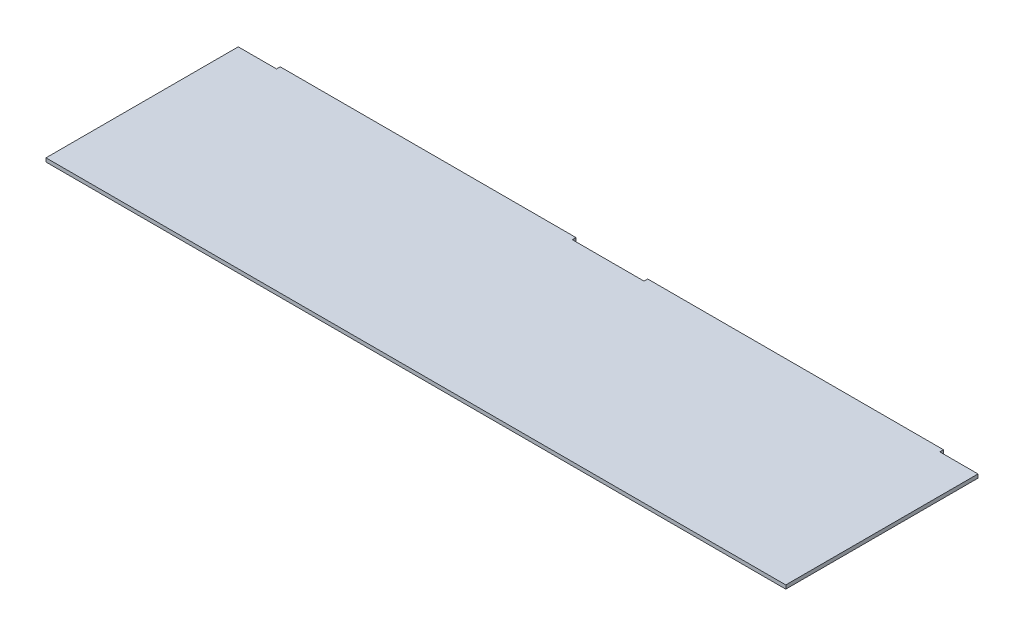
ISO-10303-21;
HEADER;
FILE_DESCRIPTION(('STEP AP214'),'2;1');
FILE_NAME('part.step','',(''),(''),'','','');
FILE_SCHEMA(('AUTOMOTIVE_DESIGN { 1 0 10303 214 1 1 1 1 }'));
ENDSEC;
DATA;
#1=APPLICATION_CONTEXT('core data for automotive mechanical design processes');
#2=APPLICATION_PROTOCOL_DEFINITION('international standard','automotive_design',2000,#1);
#3=PRODUCT_CONTEXT('',#1,'mechanical');
#4=PRODUCT('Part','Part','',(#3));
#5=PRODUCT_RELATED_PRODUCT_CATEGORY('part','',(#4));
#6=PRODUCT_DEFINITION_FORMATION('','',#4);
#7=PRODUCT_DEFINITION_CONTEXT('part definition',#1,'design');
#8=PRODUCT_DEFINITION('design','',#6,#7);
#9=PRODUCT_DEFINITION_SHAPE('','',#8);
#10=(LENGTH_UNIT() NAMED_UNIT(*) SI_UNIT(.MILLI.,.METRE.));
#11=(NAMED_UNIT(*) PLANE_ANGLE_UNIT() SI_UNIT($,.RADIAN.));
#12=(NAMED_UNIT(*) SI_UNIT($,.STERADIAN.) SOLID_ANGLE_UNIT());
#13=UNCERTAINTY_MEASURE_WITH_UNIT(LENGTH_MEASURE(1.E-05),#10,'distance_accuracy_value','');
#14=(GEOMETRIC_REPRESENTATION_CONTEXT(3) GLOBAL_UNCERTAINTY_ASSIGNED_CONTEXT((#13)) GLOBAL_UNIT_ASSIGNED_CONTEXT((#10,
#11,#12)) REPRESENTATION_CONTEXT('',''));
#15=CARTESIAN_POINT('',(0.,0.,0.));
#16=DIRECTION('',(0.,0.,1.));
#17=DIRECTION('',(1.,0.,0.));
#18=AXIS2_PLACEMENT_3D('',#15,#16,#17);
#19=CARTESIAN_POINT('',(-317.6778,1.5875,-82.55));
#20=DIRECTION('',(0.,0.,1.));
#21=DIRECTION('',(1.,0.,0.));
#22=AXIS2_PLACEMENT_3D('',#19,#20,#21);
#23=PLANE('',#22);
#24=DIRECTION('',(0.,-1.,0.));
#25=VECTOR('',#24,1.);
#26=CARTESIAN_POINT('',(284.822900000001,-1.58750000000007,-82.55));
#27=LINE('',#26,#25);
#28=CARTESIAN_POINT('',(284.822900000001,1.5875,-82.55));
#29=VERTEX_POINT('',#28);
#30=CARTESIAN_POINT('',(284.822900000001,-1.5875,-82.55));
#31=VERTEX_POINT('',#30);
#32=EDGE_CURVE('E56',#29,#31,#27,.T.);
#33=ORIENTED_EDGE('',*,*,#32,.F.);
#34=DIRECTION('',(-1.,0.,0.));
#35=VECTOR('',#34,1.);
#36=CARTESIAN_POINT('',(-317.6778,1.5875,-82.55));
#37=LINE('',#36,#35);
#38=CARTESIAN_POINT('',(317.6778,1.5875,-82.55));
#39=VERTEX_POINT('',#38);
#40=EDGE_CURVE('E184',#39,#29,#37,.T.);
#41=ORIENTED_EDGE('',*,*,#40,.F.);
#42=DIRECTION('',(0.,-1.,0.));
#43=VECTOR('',#42,1.);
#44=CARTESIAN_POINT('',(317.6778,1.5875,-82.55));
#45=LINE('',#44,#43);
#46=CARTESIAN_POINT('',(317.6778,-1.5875,-82.55));
#47=VERTEX_POINT('',#46);
#48=EDGE_CURVE('E11',#39,#47,#45,.T.);
#49=ORIENTED_EDGE('',*,*,#48,.T.);
#50=DIRECTION('',(-1.,0.,0.));
#51=VECTOR('',#50,1.);
#52=CARTESIAN_POINT('',(-317.6778,-1.5875,-82.55));
#53=LINE('',#52,#51);
#54=EDGE_CURVE('E194',#47,#31,#53,.T.);
#55=ORIENTED_EDGE('',*,*,#54,.T.);
#56=EDGE_LOOP('',(#33,#41,#49,#55));
#57=FACE_BOUND('',#56,.T.);
#58=ADVANCED_FACE('F33',(#57),#23,.F.);
#59=DIRECTION('',(0.,1.,0.));
#60=VECTOR('',#59,1.);
#61=CARTESIAN_POINT('',(30.8229000000015,1.58749999999994,-82.55));
#62=LINE('',#61,#60);
#63=CARTESIAN_POINT('',(30.8229000000015,-1.58750000000007,-82.55));
#64=VERTEX_POINT('',#63);
#65=CARTESIAN_POINT('',(30.8229000000014,1.5875,-82.55));
#66=VERTEX_POINT('',#65);
#67=EDGE_CURVE('E143',#64,#66,#62,.T.);
#68=ORIENTED_EDGE('',*,*,#67,.F.);
#69=CARTESIAN_POINT('',(-30.8229000000015,-1.5875,-82.55));
#70=VERTEX_POINT('',#69);
#71=EDGE_CURVE('E197',#64,#70,#53,.T.);
#72=ORIENTED_EDGE('',*,*,#71,.T.);
#73=DIRECTION('',(0.,-1.,0.));
#74=VECTOR('',#73,1.);
#75=CARTESIAN_POINT('',(-30.8229000000015,-1.58750000000007,-82.55));
#76=LINE('',#75,#74);
#77=CARTESIAN_POINT('',(-30.8229000000015,1.5875,-82.55));
#78=VERTEX_POINT('',#77);
#79=EDGE_CURVE('E146',#78,#70,#76,.T.);
#80=ORIENTED_EDGE('',*,*,#79,.F.);
#81=EDGE_CURVE('E48',#66,#78,#37,.T.);
#82=ORIENTED_EDGE('',*,*,#81,.F.);
#83=EDGE_LOOP('',(#68,#72,#80,#82));
#84=FACE_BOUND('',#83,.T.);
#85=ADVANCED_FACE('F230',(#84),#23,.F.);
#86=DIRECTION('',(0.,1.,0.));
#87=VECTOR('',#86,1.);
#88=CARTESIAN_POINT('',(-284.822900000001,1.58749999999994,-82.55));
#89=LINE('',#88,#87);
#90=CARTESIAN_POINT('',(-284.822900000001,-1.5875,-82.55));
#91=VERTEX_POINT('',#90);
#92=CARTESIAN_POINT('',(-284.822900000001,1.58749999999994,-82.55));
#93=VERTEX_POINT('',#92);
#94=EDGE_CURVE('E149',#91,#93,#89,.T.);
#95=ORIENTED_EDGE('',*,*,#94,.F.);
#96=CARTESIAN_POINT('',(-317.6778,-1.5875,-82.55));
#97=VERTEX_POINT('',#96);
#98=EDGE_CURVE('E193',#91,#97,#53,.T.);
#99=ORIENTED_EDGE('',*,*,#98,.T.);
#100=DIRECTION('',(0.,-1.,0.));
#101=VECTOR('',#100,1.);
#102=CARTESIAN_POINT('',(-317.6778,1.5875,-82.55));
#103=LINE('',#102,#101);
#104=CARTESIAN_POINT('',(-317.6778,1.5875,-82.55));
#105=VERTEX_POINT('',#104);
#106=EDGE_CURVE('E41',#105,#97,#103,.T.);
#107=ORIENTED_EDGE('',*,*,#106,.F.);
#108=EDGE_CURVE('E182',#93,#105,#37,.T.);
#109=ORIENTED_EDGE('',*,*,#108,.F.);
#110=EDGE_LOOP('',(#95,#99,#107,#109));
#111=FACE_BOUND('',#110,.T.);
#112=ADVANCED_FACE('F239',(#111),#23,.F.);
#113=CARTESIAN_POINT('',(317.6778,1.5875,-82.55));
#114=DIRECTION('',(-1.,0.,0.));
#115=DIRECTION('',(0.,0.,1.));
#116=AXIS2_PLACEMENT_3D('',#113,#114,#115);
#117=PLANE('',#116);
#118=DIRECTION('',(0.,0.,-1.));
#119=VECTOR('',#118,1.);
#120=CARTESIAN_POINT('',(317.6778,-1.5875,-82.55));
#121=LINE('',#120,#119);
#122=CARTESIAN_POINT('',(317.6778,-1.5875,82.55));
#123=VERTEX_POINT('',#122);
#124=EDGE_CURVE('E178',#123,#47,#121,.T.);
#125=ORIENTED_EDGE('',*,*,#124,.T.);
#126=ORIENTED_EDGE('',*,*,#48,.F.);
#127=DIRECTION('',(0.,0.,-1.));
#128=VECTOR('',#127,1.);
#129=CARTESIAN_POINT('',(317.6778,1.5875,-82.55));
#130=LINE('',#129,#128);
#131=CARTESIAN_POINT('',(317.6778,1.5875,82.55));
#132=VERTEX_POINT('',#131);
#133=EDGE_CURVE('E179',#132,#39,#130,.T.);
#134=ORIENTED_EDGE('',*,*,#133,.F.);
#135=DIRECTION('',(0.,-1.,0.));
#136=VECTOR('',#135,1.);
#137=CARTESIAN_POINT('',(317.6778,1.5875,82.55));
#138=LINE('',#137,#136);
#139=EDGE_CURVE('E190',#132,#123,#138,.T.);
#140=ORIENTED_EDGE('',*,*,#139,.T.);
#141=EDGE_LOOP('',(#125,#126,#134,#140));
#142=FACE_BOUND('',#141,.T.);
#143=ADVANCED_FACE('F35',(#142),#117,.F.);
#144=CARTESIAN_POINT('',(-317.6778,1.5875,-82.55));
#145=DIRECTION('',(1.,0.,0.));
#146=DIRECTION('',(0.,0.,-1.));
#147=AXIS2_PLACEMENT_3D('',#144,#145,#146);
#148=PLANE('',#147);
#149=DIRECTION('',(0.,0.,1.));
#150=VECTOR('',#149,1.);
#151=CARTESIAN_POINT('',(-317.6778,-1.5875,-82.55));
#152=LINE('',#151,#150);
#153=CARTESIAN_POINT('',(-317.6778,-1.5875,82.55));
#154=VERTEX_POINT('',#153);
#155=EDGE_CURVE('E196',#97,#154,#152,.T.);
#156=ORIENTED_EDGE('',*,*,#155,.T.);
#157=DIRECTION('',(0.,-1.,0.));
#158=VECTOR('',#157,1.);
#159=CARTESIAN_POINT('',(-317.6778,1.5875,82.55));
#160=LINE('',#159,#158);
#161=CARTESIAN_POINT('',(-317.6778,1.5875,82.55));
#162=VERTEX_POINT('',#161);
#163=EDGE_CURVE('E202',#162,#154,#160,.T.);
#164=ORIENTED_EDGE('',*,*,#163,.F.);
#165=DIRECTION('',(0.,0.,1.));
#166=VECTOR('',#165,1.);
#167=CARTESIAN_POINT('',(-317.6778,1.5875,-82.55));
#168=LINE('',#167,#166);
#169=EDGE_CURVE('E186',#105,#162,#168,.T.);
#170=ORIENTED_EDGE('',*,*,#169,.F.);
#171=ORIENTED_EDGE('',*,*,#106,.T.);
#172=EDGE_LOOP('',(#156,#164,#170,#171));
#173=FACE_BOUND('',#172,.T.);
#174=ADVANCED_FACE('F209',(#173),#148,.F.);
#175=CARTESIAN_POINT('',(-317.6778,1.5875,82.55));
#176=DIRECTION('',(0.,0.,-1.));
#177=DIRECTION('',(-1.,0.,0.));
#178=AXIS2_PLACEMENT_3D('',#175,#176,#177);
#179=PLANE('',#178);
#180=DIRECTION('',(1.,0.,0.));
#181=VECTOR('',#180,1.);
#182=CARTESIAN_POINT('',(-317.6778,-1.5875,82.55));
#183=LINE('',#182,#181);
#184=EDGE_CURVE('E183',#154,#123,#183,.T.);
#185=ORIENTED_EDGE('',*,*,#184,.T.);
#186=ORIENTED_EDGE('',*,*,#139,.F.);
#187=DIRECTION('',(1.,0.,0.));
#188=VECTOR('',#187,1.);
#189=CARTESIAN_POINT('',(-317.6778,1.5875,82.55));
#190=LINE('',#189,#188);
#191=EDGE_CURVE('E188',#162,#132,#190,.T.);
#192=ORIENTED_EDGE('',*,*,#191,.F.);
#193=ORIENTED_EDGE('',*,*,#163,.T.);
#194=EDGE_LOOP('',(#185,#186,#192,#193));
#195=FACE_BOUND('',#194,.T.);
#196=ADVANCED_FACE('F217',(#195),#179,.F.);
#197=CARTESIAN_POINT('',(0.,1.5875,0.));
#198=DIRECTION('',(0.,1.,0.));
#199=DIRECTION('',(0.,0.,1.));
#200=AXIS2_PLACEMENT_3D('',#197,#198,#199);
#201=PLANE('',#200);
#202=ORIENTED_EDGE('',*,*,#133,.T.);
#203=ORIENTED_EDGE('',*,*,#40,.T.);
#204=DIRECTION('',(0.,0.,1.));
#205=VECTOR('',#204,1.);
#206=CARTESIAN_POINT('',(284.822900000001,1.58749999999994,-85.725));
#207=LINE('',#206,#205);
#208=CARTESIAN_POINT('',(284.822900000001,1.58749999999994,-85.725));
#209=VERTEX_POINT('',#208);
#210=EDGE_CURVE('E366',#209,#29,#207,.T.);
#211=ORIENTED_EDGE('',*,*,#210,.F.);
#212=DIRECTION('',(1.,0.,0.));
#213=VECTOR('',#212,1.);
#214=CARTESIAN_POINT('',(284.822900000001,1.58749999999994,-85.725));
#215=LINE('',#214,#213);
#216=CARTESIAN_POINT('',(30.8229000000015,1.58749999999994,-85.725));
#217=VERTEX_POINT('',#216);
#218=EDGE_CURVE('E139',#217,#209,#215,.T.);
#219=ORIENTED_EDGE('',*,*,#218,.F.);
#220=DIRECTION('',(0.,0.,1.));
#221=VECTOR('',#220,1.);
#222=CARTESIAN_POINT('',(30.8229000000015,1.58749999999994,-85.725));
#223=LINE('',#222,#221);
#224=EDGE_CURVE('E151',#217,#66,#223,.T.);
#225=ORIENTED_EDGE('',*,*,#224,.T.);
#226=ORIENTED_EDGE('',*,*,#81,.T.);
#227=DIRECTION('',(0.,0.,1.));
#228=VECTOR('',#227,1.);
#229=CARTESIAN_POINT('',(-30.8229000000015,1.58749999999994,-85.725));
#230=LINE('',#229,#228);
#231=CARTESIAN_POINT('',(-30.8229000000015,1.58749999999994,-85.725));
#232=VERTEX_POINT('',#231);
#233=EDGE_CURVE('E163',#232,#78,#230,.T.);
#234=ORIENTED_EDGE('',*,*,#233,.F.);
#235=DIRECTION('',(1.,0.,0.));
#236=VECTOR('',#235,1.);
#237=CARTESIAN_POINT('',(-30.8229000000015,1.58749999999994,-85.725));
#238=LINE('',#237,#236);
#239=CARTESIAN_POINT('',(-284.822900000001,1.58749999999994,-85.725));
#240=VERTEX_POINT('',#239);
#241=EDGE_CURVE('E162',#240,#232,#238,.T.);
#242=ORIENTED_EDGE('',*,*,#241,.F.);
#243=DIRECTION('',(0.,0.,1.));
#244=VECTOR('',#243,1.);
#245=CARTESIAN_POINT('',(-284.822900000001,1.58749999999994,-85.725));
#246=LINE('',#245,#244);
#247=EDGE_CURVE('E169',#240,#93,#246,.T.);
#248=ORIENTED_EDGE('',*,*,#247,.T.);
#249=ORIENTED_EDGE('',*,*,#108,.T.);
#250=ORIENTED_EDGE('',*,*,#169,.T.);
#251=ORIENTED_EDGE('',*,*,#191,.T.);
#252=EDGE_LOOP('',(#202,#203,#211,#219,#225,#226,#234,#242,#248,#249,#250,#251));
#253=FACE_BOUND('',#252,.T.);
#254=ADVANCED_FACE('F223',(#253),#201,.T.);
#255=CARTESIAN_POINT('',(0.,-1.5875,0.));
#256=DIRECTION('',(0.,1.,0.));
#257=DIRECTION('',(0.,0.,1.));
#258=AXIS2_PLACEMENT_3D('',#255,#256,#257);
#259=PLANE('',#258);
#260=ORIENTED_EDGE('',*,*,#124,.F.);
#261=ORIENTED_EDGE('',*,*,#184,.F.);
#262=ORIENTED_EDGE('',*,*,#155,.F.);
#263=ORIENTED_EDGE('',*,*,#98,.F.);
#264=DIRECTION('',(0.,0.,1.));
#265=VECTOR('',#264,1.);
#266=CARTESIAN_POINT('',(-284.822900000001,-1.58750000000007,-85.725));
#267=LINE('',#266,#265);
#268=CARTESIAN_POINT('',(-284.822900000001,-1.58750000000007,-85.725));
#269=VERTEX_POINT('',#268);
#270=EDGE_CURVE('E172',#269,#91,#267,.T.);
#271=ORIENTED_EDGE('',*,*,#270,.F.);
#272=DIRECTION('',(-1.,0.,0.));
#273=VECTOR('',#272,1.);
#274=CARTESIAN_POINT('',(-30.8229000000015,-1.58750000000007,-85.725));
#275=LINE('',#274,#273);
#276=CARTESIAN_POINT('',(-30.8229000000015,-1.58750000000007,-85.725));
#277=VERTEX_POINT('',#276);
#278=EDGE_CURVE('E158',#277,#269,#275,.T.);
#279=ORIENTED_EDGE('',*,*,#278,.F.);
#280=DIRECTION('',(0.,0.,1.));
#281=VECTOR('',#280,1.);
#282=CARTESIAN_POINT('',(-30.8229000000015,-1.58750000000007,-85.725));
#283=LINE('',#282,#281);
#284=EDGE_CURVE('E175',#277,#70,#283,.T.);
#285=ORIENTED_EDGE('',*,*,#284,.T.);
#286=ORIENTED_EDGE('',*,*,#71,.F.);
#287=DIRECTION('',(0.,0.,1.));
#288=VECTOR('',#287,1.);
#289=CARTESIAN_POINT('',(30.8229000000015,-1.58750000000007,-85.725));
#290=LINE('',#289,#288);
#291=CARTESIAN_POINT('',(30.8229000000015,-1.58750000000007,-85.725));
#292=VERTEX_POINT('',#291);
#293=EDGE_CURVE('E130',#292,#64,#290,.T.);
#294=ORIENTED_EDGE('',*,*,#293,.F.);
#295=DIRECTION('',(-1.,0.,0.));
#296=VECTOR('',#295,1.);
#297=CARTESIAN_POINT('',(284.822900000001,-1.58750000000007,-85.725));
#298=LINE('',#297,#296);
#299=CARTESIAN_POINT('',(284.822900000001,-1.58750000000007,-85.725));
#300=VERTEX_POINT('',#299);
#301=EDGE_CURVE('E123',#300,#292,#298,.T.);
#302=ORIENTED_EDGE('',*,*,#301,.F.);
#303=DIRECTION('',(0.,0.,1.));
#304=VECTOR('',#303,1.);
#305=CARTESIAN_POINT('',(284.822900000001,-1.58750000000007,-85.725));
#306=LINE('',#305,#304);
#307=EDGE_CURVE('E128',#300,#31,#306,.T.);
#308=ORIENTED_EDGE('',*,*,#307,.T.);
#309=ORIENTED_EDGE('',*,*,#54,.F.);
#310=EDGE_LOOP('',(#260,#261,#262,#263,#271,#279,#285,#286,#294,#302,#308,#309));
#311=FACE_BOUND('',#310,.T.);
#312=ADVANCED_FACE('F126',(#311),#259,.F.);
#313=CARTESIAN_POINT('',(-30.8229000000015,-1.58750000000007,-85.725));
#314=DIRECTION('',(-1.,0.,0.));
#315=DIRECTION('',(0.,0.,1.));
#316=AXIS2_PLACEMENT_3D('',#313,#314,#315);
#317=PLANE('',#316);
#318=ORIENTED_EDGE('',*,*,#79,.T.);
#319=ORIENTED_EDGE('',*,*,#284,.F.);
#320=DIRECTION('',(0.,-1.,0.));
#321=VECTOR('',#320,1.);
#322=CARTESIAN_POINT('',(-30.8229000000015,-1.58750000000007,-85.725));
#323=LINE('',#322,#321);
#324=EDGE_CURVE('E155',#232,#277,#323,.T.);
#325=ORIENTED_EDGE('',*,*,#324,.F.);
#326=ORIENTED_EDGE('',*,*,#233,.T.);
#327=EDGE_LOOP('',(#318,#319,#325,#326));
#328=FACE_BOUND('',#327,.T.);
#329=ADVANCED_FACE('F233',(#328),#317,.F.);
#330=CARTESIAN_POINT('',(-284.822900000001,1.58749999999994,-85.725));
#331=DIRECTION('',(1.,0.,0.));
#332=DIRECTION('',(0.,1.,0.));
#333=AXIS2_PLACEMENT_3D('',#330,#331,#332);
#334=PLANE('',#333);
#335=ORIENTED_EDGE('',*,*,#94,.T.);
#336=ORIENTED_EDGE('',*,*,#247,.F.);
#337=DIRECTION('',(0.,1.,0.));
#338=VECTOR('',#337,1.);
#339=CARTESIAN_POINT('',(-284.822900000001,1.58749999999994,-85.725));
#340=LINE('',#339,#338);
#341=EDGE_CURVE('E160',#269,#240,#340,.T.);
#342=ORIENTED_EDGE('',*,*,#341,.F.);
#343=ORIENTED_EDGE('',*,*,#270,.T.);
#344=EDGE_LOOP('',(#335,#336,#342,#343));
#345=FACE_BOUND('',#344,.T.);
#346=ADVANCED_FACE('F238',(#345),#334,.F.);
#347=CARTESIAN_POINT('',(0.,0.,-85.725));
#348=DIRECTION('',(0.,0.,1.));
#349=DIRECTION('',(1.,0.,0.));
#350=AXIS2_PLACEMENT_3D('',#347,#348,#349);
#351=PLANE('',#350);
#352=ORIENTED_EDGE('',*,*,#324,.T.);
#353=ORIENTED_EDGE('',*,*,#278,.T.);
#354=ORIENTED_EDGE('',*,*,#341,.T.);
#355=ORIENTED_EDGE('',*,*,#241,.T.);
#356=EDGE_LOOP('',(#352,#353,#354,#355));
#357=FACE_BOUND('',#356,.T.);
#358=ADVANCED_FACE('F235',(#357),#351,.F.);
#359=CARTESIAN_POINT('',(284.822900000001,-1.58750000000007,-85.725));
#360=DIRECTION('',(-1.,0.,0.));
#361=DIRECTION('',(0.,-1.,0.));
#362=AXIS2_PLACEMENT_3D('',#359,#360,#361);
#363=PLANE('',#362);
#364=ORIENTED_EDGE('',*,*,#32,.T.);
#365=ORIENTED_EDGE('',*,*,#307,.F.);
#366=DIRECTION('',(0.,-1.,0.));
#367=VECTOR('',#366,1.);
#368=CARTESIAN_POINT('',(284.822900000001,-1.58750000000007,-85.725));
#369=LINE('',#368,#367);
#370=EDGE_CURVE('E134',#209,#300,#369,.T.);
#371=ORIENTED_EDGE('',*,*,#370,.F.);
#372=ORIENTED_EDGE('',*,*,#210,.T.);
#373=EDGE_LOOP('',(#364,#365,#371,#372));
#374=FACE_BOUND('',#373,.T.);
#375=ADVANCED_FACE('F145',(#374),#363,.F.);
#376=CARTESIAN_POINT('',(30.8229000000015,1.58749999999994,-85.725));
#377=DIRECTION('',(1.,0.,0.));
#378=DIRECTION('',(0.,0.,-1.));
#379=AXIS2_PLACEMENT_3D('',#376,#377,#378);
#380=PLANE('',#379);
#381=ORIENTED_EDGE('',*,*,#67,.T.);
#382=ORIENTED_EDGE('',*,*,#224,.F.);
#383=DIRECTION('',(0.,1.,0.));
#384=VECTOR('',#383,1.);
#385=CARTESIAN_POINT('',(30.8229000000015,1.58749999999994,-85.725));
#386=LINE('',#385,#384);
#387=EDGE_CURVE('E133',#292,#217,#386,.T.);
#388=ORIENTED_EDGE('',*,*,#387,.F.);
#389=ORIENTED_EDGE('',*,*,#293,.T.);
#390=EDGE_LOOP('',(#381,#382,#388,#389));
#391=FACE_BOUND('',#390,.T.);
#392=ADVANCED_FACE('F311',(#391),#380,.F.);
#393=CARTESIAN_POINT('',(0.,0.,-85.725));
#394=DIRECTION('',(0.,0.,1.));
#395=DIRECTION('',(1.,0.,0.));
#396=AXIS2_PLACEMENT_3D('',#393,#394,#395);
#397=PLANE('',#396);
#398=ORIENTED_EDGE('',*,*,#370,.T.);
#399=ORIENTED_EDGE('',*,*,#301,.T.);
#400=ORIENTED_EDGE('',*,*,#387,.T.);
#401=ORIENTED_EDGE('',*,*,#218,.T.);
#402=EDGE_LOOP('',(#398,#399,#400,#401));
#403=FACE_BOUND('',#402,.T.);
#404=ADVANCED_FACE('F137',(#403),#397,.F.);
#405=CLOSED_SHELL('',(#58,#85,#112,#143,#174,#196,#254,#312,#329,#346,#358,#375,#392,#404));
#406=MANIFOLD_SOLID_BREP('B2',#405);
#407=ADVANCED_BREP_SHAPE_REPRESENTATION('',(#18,#406),#14);
#408=SHAPE_DEFINITION_REPRESENTATION(#9,#407);
ENDSEC;
END-ISO-10303-21;
